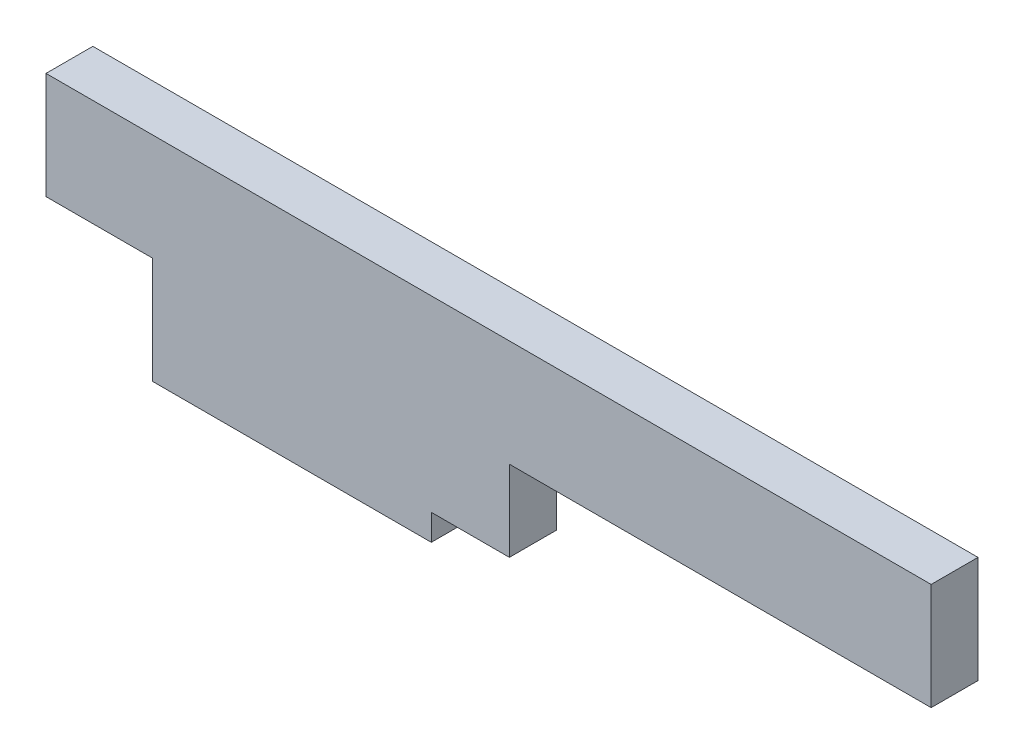
ISO-10303-21;
HEADER;
FILE_DESCRIPTION(('STEP AP214'),'2;1');
FILE_NAME('part.step','',(''),(''),'','','');
FILE_SCHEMA(('AUTOMOTIVE_DESIGN { 1 0 10303 214 1 1 1 1 }'));
ENDSEC;
DATA;
#1=APPLICATION_CONTEXT('core data for automotive mechanical design processes');
#2=APPLICATION_PROTOCOL_DEFINITION('international standard','automotive_design',2000,#1);
#3=PRODUCT_CONTEXT('',#1,'mechanical');
#4=PRODUCT('Part','Part','',(#3));
#5=PRODUCT_RELATED_PRODUCT_CATEGORY('part','',(#4));
#6=PRODUCT_DEFINITION_FORMATION('','',#4);
#7=PRODUCT_DEFINITION_CONTEXT('part definition',#1,'design');
#8=PRODUCT_DEFINITION('design','',#6,#7);
#9=PRODUCT_DEFINITION_SHAPE('','',#8);
#10=(LENGTH_UNIT() NAMED_UNIT(*) SI_UNIT(.MILLI.,.METRE.));
#11=(NAMED_UNIT(*) PLANE_ANGLE_UNIT() SI_UNIT($,.RADIAN.));
#12=(NAMED_UNIT(*) SI_UNIT($,.STERADIAN.) SOLID_ANGLE_UNIT());
#13=UNCERTAINTY_MEASURE_WITH_UNIT(LENGTH_MEASURE(1.E-05),#10,'distance_accuracy_value','');
#14=(GEOMETRIC_REPRESENTATION_CONTEXT(3) GLOBAL_UNCERTAINTY_ASSIGNED_CONTEXT((#13)) GLOBAL_UNIT_ASSIGNED_CONTEXT((#10,
#11,#12)) REPRESENTATION_CONTEXT('',''));
#15=CARTESIAN_POINT('',(0.,0.,0.));
#16=DIRECTION('',(0.,0.,1.));
#17=DIRECTION('',(1.,0.,0.));
#18=AXIS2_PLACEMENT_3D('',#15,#16,#17);
#19=CARTESIAN_POINT('',(-85.,-1.91479099678457,9.));
#20=DIRECTION('',(0.,1.,0.));
#21=DIRECTION('',(0.,0.,1.));
#22=AXIS2_PLACEMENT_3D('',#19,#20,#21);
#23=PLANE('',#22);
#24=DIRECTION('',(1.,0.,0.));
#25=VECTOR('',#24,1.);
#26=CARTESIAN_POINT('',(-85.,-1.91479099678457,0.));
#27=LINE('',#26,#25);
#28=CARTESIAN_POINT('',(-85.,-1.91479099678457,0.));
#29=VERTEX_POINT('',#28);
#30=CARTESIAN_POINT('',(-64.5,-1.91479099678457,0.));
#31=VERTEX_POINT('',#30);
#32=EDGE_CURVE('E152',#29,#31,#27,.T.);
#33=ORIENTED_EDGE('',*,*,#32,.T.);
#34=DIRECTION('',(0.,0.,-1.));
#35=VECTOR('',#34,1.);
#36=CARTESIAN_POINT('',(-64.5,-1.91479099678457,9.));
#37=LINE('',#36,#35);
#38=CARTESIAN_POINT('',(-64.5,-1.91479099678457,9.));
#39=VERTEX_POINT('',#38);
#40=EDGE_CURVE('E11',#39,#31,#37,.T.);
#41=ORIENTED_EDGE('',*,*,#40,.F.);
#42=DIRECTION('',(1.,0.,0.));
#43=VECTOR('',#42,1.);
#44=CARTESIAN_POINT('',(-85.,-1.91479099678457,9.));
#45=LINE('',#44,#43);
#46=CARTESIAN_POINT('',(-85.,-1.91479099678457,9.));
#47=VERTEX_POINT('',#46);
#48=EDGE_CURVE('E180',#47,#39,#45,.T.);
#49=ORIENTED_EDGE('',*,*,#48,.F.);
#50=DIRECTION('',(0.,0.,-1.));
#51=VECTOR('',#50,1.);
#52=CARTESIAN_POINT('',(-85.,-1.91479099678457,9.));
#53=LINE('',#52,#51);
#54=EDGE_CURVE('E148',#47,#29,#53,.T.);
#55=ORIENTED_EDGE('',*,*,#54,.T.);
#56=EDGE_LOOP('',(#33,#41,#49,#55));
#57=FACE_BOUND('',#56,.T.);
#58=ADVANCED_FACE('F39',(#57),#23,.F.);
#59=CARTESIAN_POINT('',(-64.5,-1.91479099678457,9.));
#60=DIRECTION('',(1.,0.,0.));
#61=DIRECTION('',(0.,0.,-1.));
#62=AXIS2_PLACEMENT_3D('',#59,#60,#61);
#63=PLANE('',#62);
#64=DIRECTION('',(0.,-1.,0.));
#65=VECTOR('',#64,1.);
#66=CARTESIAN_POINT('',(-64.5,-1.91479099678457,0.));
#67=LINE('',#66,#65);
#68=CARTESIAN_POINT('',(-64.5,-22.4147909967846,0.));
#69=VERTEX_POINT('',#68);
#70=EDGE_CURVE('E156',#31,#69,#67,.T.);
#71=ORIENTED_EDGE('',*,*,#70,.T.);
#72=DIRECTION('',(0.,0.,-1.));
#73=VECTOR('',#72,1.);
#74=CARTESIAN_POINT('',(-64.5,-22.4147909967846,9.));
#75=LINE('',#74,#73);
#76=CARTESIAN_POINT('',(-64.5,-22.4147909967846,9.));
#77=VERTEX_POINT('',#76);
#78=EDGE_CURVE('E48',#77,#69,#75,.T.);
#79=ORIENTED_EDGE('',*,*,#78,.F.);
#80=DIRECTION('',(0.,-1.,0.));
#81=VECTOR('',#80,1.);
#82=CARTESIAN_POINT('',(-64.5,-1.91479099678457,9.));
#83=LINE('',#82,#81);
#84=EDGE_CURVE('E105',#39,#77,#83,.T.);
#85=ORIENTED_EDGE('',*,*,#84,.F.);
#86=ORIENTED_EDGE('',*,*,#40,.T.);
#87=EDGE_LOOP('',(#71,#79,#85,#86));
#88=FACE_BOUND('',#87,.T.);
#89=ADVANCED_FACE('F244',(#88),#63,.F.);
#90=CARTESIAN_POINT('',(-64.5,-22.4147909967846,9.));
#91=DIRECTION('',(0.,1.,0.));
#92=DIRECTION('',(-1.,0.,0.));
#93=AXIS2_PLACEMENT_3D('',#90,#91,#92);
#94=PLANE('',#93);
#95=DIRECTION('',(1.,0.,0.));
#96=VECTOR('',#95,1.);
#97=CARTESIAN_POINT('',(-64.5,-22.4147909967846,0.));
#98=LINE('',#97,#96);
#99=CARTESIAN_POINT('',(-11.,-22.4147909967846,0.));
#100=VERTEX_POINT('',#99);
#101=EDGE_CURVE('E159',#69,#100,#98,.T.);
#102=ORIENTED_EDGE('',*,*,#101,.T.);
#103=DIRECTION('',(0.,0.,-1.));
#104=VECTOR('',#103,1.);
#105=CARTESIAN_POINT('',(-11.,-22.4147909967846,9.));
#106=LINE('',#105,#104);
#107=CARTESIAN_POINT('',(-11.,-22.4147909967846,9.));
#108=VERTEX_POINT('',#107);
#109=EDGE_CURVE('E199',#108,#100,#106,.T.);
#110=ORIENTED_EDGE('',*,*,#109,.F.);
#111=DIRECTION('',(1.,0.,0.));
#112=VECTOR('',#111,1.);
#113=CARTESIAN_POINT('',(-64.5,-22.4147909967846,9.));
#114=LINE('',#113,#112);
#115=EDGE_CURVE('E209',#77,#108,#114,.T.);
#116=ORIENTED_EDGE('',*,*,#115,.F.);
#117=ORIENTED_EDGE('',*,*,#78,.T.);
#118=EDGE_LOOP('',(#102,#110,#116,#117));
#119=FACE_BOUND('',#118,.T.);
#120=ADVANCED_FACE('F207',(#119),#94,.F.);
#121=CARTESIAN_POINT('',(-11.,-22.4147909967846,9.));
#122=DIRECTION('',(-1.,0.,0.));
#123=DIRECTION('',(0.,0.,1.));
#124=AXIS2_PLACEMENT_3D('',#121,#122,#123);
#125=PLANE('',#124);
#126=DIRECTION('',(0.,1.,0.));
#127=VECTOR('',#126,1.);
#128=CARTESIAN_POINT('',(-11.,-22.4147909967846,0.));
#129=LINE('',#128,#127);
#130=CARTESIAN_POINT('',(-11.,-17.4147909967846,0.));
#131=VERTEX_POINT('',#130);
#132=EDGE_CURVE('E162',#100,#131,#129,.T.);
#133=ORIENTED_EDGE('',*,*,#132,.T.);
#134=DIRECTION('',(0.,0.,-1.));
#135=VECTOR('',#134,1.);
#136=CARTESIAN_POINT('',(-11.,-17.4147909967846,9.));
#137=LINE('',#136,#135);
#138=CARTESIAN_POINT('',(-11.,-17.4147909967846,9.));
#139=VERTEX_POINT('',#138);
#140=EDGE_CURVE('E195',#139,#131,#137,.T.);
#141=ORIENTED_EDGE('',*,*,#140,.F.);
#142=DIRECTION('',(0.,1.,0.));
#143=VECTOR('',#142,1.);
#144=CARTESIAN_POINT('',(-11.,-22.4147909967846,9.));
#145=LINE('',#144,#143);
#146=EDGE_CURVE('E228',#108,#139,#145,.T.);
#147=ORIENTED_EDGE('',*,*,#146,.F.);
#148=ORIENTED_EDGE('',*,*,#109,.T.);
#149=EDGE_LOOP('',(#133,#141,#147,#148));
#150=FACE_BOUND('',#149,.T.);
#151=ADVANCED_FACE('F218',(#150),#125,.F.);
#152=CARTESIAN_POINT('',(-11.,-17.4147909967846,9.));
#153=DIRECTION('',(0.,1.,0.));
#154=DIRECTION('',(-1.,0.,0.));
#155=AXIS2_PLACEMENT_3D('',#152,#153,#154);
#156=PLANE('',#155);
#157=DIRECTION('',(1.,0.,0.));
#158=VECTOR('',#157,1.);
#159=CARTESIAN_POINT('',(-11.,-17.4147909967846,0.));
#160=LINE('',#159,#158);
#161=CARTESIAN_POINT('',(3.99999999999999,-17.4147909967846,0.));
#162=VERTEX_POINT('',#161);
#163=EDGE_CURVE('E165',#131,#162,#160,.T.);
#164=ORIENTED_EDGE('',*,*,#163,.T.);
#165=DIRECTION('',(0.,0.,-1.));
#166=VECTOR('',#165,1.);
#167=CARTESIAN_POINT('',(3.99999999999999,-17.4147909967846,9.));
#168=LINE('',#167,#166);
#169=CARTESIAN_POINT('',(3.99999999999999,-17.4147909967846,9.));
#170=VERTEX_POINT('',#169);
#171=EDGE_CURVE('E191',#170,#162,#168,.T.);
#172=ORIENTED_EDGE('',*,*,#171,.F.);
#173=DIRECTION('',(1.,0.,0.));
#174=VECTOR('',#173,1.);
#175=CARTESIAN_POINT('',(-11.,-17.4147909967846,9.));
#176=LINE('',#175,#174);
#177=EDGE_CURVE('E224',#139,#170,#176,.T.);
#178=ORIENTED_EDGE('',*,*,#177,.F.);
#179=ORIENTED_EDGE('',*,*,#140,.T.);
#180=EDGE_LOOP('',(#164,#172,#178,#179));
#181=FACE_BOUND('',#180,.T.);
#182=ADVANCED_FACE('F222',(#181),#156,.F.);
#183=CARTESIAN_POINT('',(3.99999999999999,-17.4147909967846,9.));
#184=DIRECTION('',(-1.,0.,0.));
#185=DIRECTION('',(0.,0.,1.));
#186=AXIS2_PLACEMENT_3D('',#183,#184,#185);
#187=PLANE('',#186);
#188=DIRECTION('',(0.,1.,0.));
#189=VECTOR('',#188,1.);
#190=CARTESIAN_POINT('',(3.99999999999999,-17.4147909967846,0.));
#191=LINE('',#190,#189);
#192=CARTESIAN_POINT('',(3.99999999999999,-1.91479099678458,0.));
#193=VERTEX_POINT('',#192);
#194=EDGE_CURVE('E168',#162,#193,#191,.T.);
#195=ORIENTED_EDGE('',*,*,#194,.T.);
#196=DIRECTION('',(0.,0.,-1.));
#197=VECTOR('',#196,1.);
#198=CARTESIAN_POINT('',(3.99999999999999,-1.91479099678458,9.));
#199=LINE('',#198,#197);
#200=CARTESIAN_POINT('',(3.99999999999999,-1.91479099678458,9.));
#201=VERTEX_POINT('',#200);
#202=EDGE_CURVE('E187',#201,#193,#199,.T.);
#203=ORIENTED_EDGE('',*,*,#202,.F.);
#204=DIRECTION('',(0.,1.,0.));
#205=VECTOR('',#204,1.);
#206=CARTESIAN_POINT('',(3.99999999999999,-17.4147909967846,9.));
#207=LINE('',#206,#205);
#208=EDGE_CURVE('E227',#170,#201,#207,.T.);
#209=ORIENTED_EDGE('',*,*,#208,.F.);
#210=ORIENTED_EDGE('',*,*,#171,.T.);
#211=EDGE_LOOP('',(#195,#203,#209,#210));
#212=FACE_BOUND('',#211,.T.);
#213=ADVANCED_FACE('F256',(#212),#187,.F.);
#214=CARTESIAN_POINT('',(85.,-1.91479099678457,9.));
#215=DIRECTION('',(0.,1.,0.));
#216=DIRECTION('',(-1.,0.,0.));
#217=AXIS2_PLACEMENT_3D('',#214,#215,#216);
#218=PLANE('',#217);
#219=DIRECTION('',(1.,0.,0.));
#220=VECTOR('',#219,1.);
#221=CARTESIAN_POINT('',(85.,-1.91479099678457,0.));
#222=LINE('',#221,#220);
#223=CARTESIAN_POINT('',(85.,-1.91479099678457,0.));
#224=VERTEX_POINT('',#223);
#225=EDGE_CURVE('E171',#193,#224,#222,.T.);
#226=ORIENTED_EDGE('',*,*,#225,.T.);
#227=DIRECTION('',(0.,0.,-1.));
#228=VECTOR('',#227,1.);
#229=CARTESIAN_POINT('',(85.,-1.91479099678457,9.));
#230=LINE('',#229,#228);
#231=CARTESIAN_POINT('',(85.,-1.91479099678457,9.));
#232=VERTEX_POINT('',#231);
#233=EDGE_CURVE('E141',#232,#224,#230,.T.);
#234=ORIENTED_EDGE('',*,*,#233,.F.);
#235=DIRECTION('',(1.,0.,0.));
#236=VECTOR('',#235,1.);
#237=CARTESIAN_POINT('',(85.,-1.91479099678457,9.));
#238=LINE('',#237,#236);
#239=EDGE_CURVE('E130',#201,#232,#238,.T.);
#240=ORIENTED_EDGE('',*,*,#239,.F.);
#241=ORIENTED_EDGE('',*,*,#202,.T.);
#242=EDGE_LOOP('',(#226,#234,#240,#241));
#243=FACE_BOUND('',#242,.T.);
#244=ADVANCED_FACE('F259',(#243),#218,.F.);
#245=CARTESIAN_POINT('',(85.,18.5852090032154,9.));
#246=DIRECTION('',(-1.,0.,0.));
#247=DIRECTION('',(0.,0.,1.));
#248=AXIS2_PLACEMENT_3D('',#245,#246,#247);
#249=PLANE('',#248);
#250=DIRECTION('',(0.,1.,0.));
#251=VECTOR('',#250,1.);
#252=CARTESIAN_POINT('',(85.,18.5852090032154,0.));
#253=LINE('',#252,#251);
#254=CARTESIAN_POINT('',(85.,18.5852090032154,0.));
#255=VERTEX_POINT('',#254);
#256=EDGE_CURVE('E139',#224,#255,#253,.T.);
#257=ORIENTED_EDGE('',*,*,#256,.T.);
#258=DIRECTION('',(0.,0.,-1.));
#259=VECTOR('',#258,1.);
#260=CARTESIAN_POINT('',(85.,18.5852090032154,9.));
#261=LINE('',#260,#259);
#262=CARTESIAN_POINT('',(85.,18.5852090032154,9.));
#263=VERTEX_POINT('',#262);
#264=EDGE_CURVE('E136',#263,#255,#261,.T.);
#265=ORIENTED_EDGE('',*,*,#264,.F.);
#266=DIRECTION('',(0.,1.,0.));
#267=VECTOR('',#266,1.);
#268=CARTESIAN_POINT('',(85.,18.5852090032154,9.));
#269=LINE('',#268,#267);
#270=EDGE_CURVE('E124',#232,#263,#269,.T.);
#271=ORIENTED_EDGE('',*,*,#270,.F.);
#272=ORIENTED_EDGE('',*,*,#233,.T.);
#273=EDGE_LOOP('',(#257,#265,#271,#272));
#274=FACE_BOUND('',#273,.T.);
#275=ADVANCED_FACE('F137',(#274),#249,.F.);
#276=CARTESIAN_POINT('',(-85.,18.5852090032154,9.));
#277=DIRECTION('',(0.,-1.,0.));
#278=DIRECTION('',(0.,0.,-1.));
#279=AXIS2_PLACEMENT_3D('',#276,#277,#278);
#280=PLANE('',#279);
#281=DIRECTION('',(-1.,0.,0.));
#282=VECTOR('',#281,1.);
#283=CARTESIAN_POINT('',(-85.,18.5852090032154,0.));
#284=LINE('',#283,#282);
#285=CARTESIAN_POINT('',(-85.,18.5852090032154,0.));
#286=VERTEX_POINT('',#285);
#287=EDGE_CURVE('E91',#255,#286,#284,.T.);
#288=ORIENTED_EDGE('',*,*,#287,.T.);
#289=DIRECTION('',(0.,0.,-1.));
#290=VECTOR('',#289,1.);
#291=CARTESIAN_POINT('',(-85.,18.5852090032154,9.));
#292=LINE('',#291,#290);
#293=CARTESIAN_POINT('',(-85.,18.5852090032154,9.));
#294=VERTEX_POINT('',#293);
#295=EDGE_CURVE('E142',#294,#286,#292,.T.);
#296=ORIENTED_EDGE('',*,*,#295,.F.);
#297=DIRECTION('',(-1.,0.,0.));
#298=VECTOR('',#297,1.);
#299=CARTESIAN_POINT('',(-85.,18.5852090032154,9.));
#300=LINE('',#299,#298);
#301=EDGE_CURVE('E128',#263,#294,#300,.T.);
#302=ORIENTED_EDGE('',*,*,#301,.F.);
#303=ORIENTED_EDGE('',*,*,#264,.T.);
#304=EDGE_LOOP('',(#288,#296,#302,#303));
#305=FACE_BOUND('',#304,.T.);
#306=ADVANCED_FACE('F144',(#305),#280,.F.);
#307=CARTESIAN_POINT('',(-85.,18.5852090032154,9.));
#308=DIRECTION('',(1.,0.,0.));
#309=DIRECTION('',(0.,0.,-1.));
#310=AXIS2_PLACEMENT_3D('',#307,#308,#309);
#311=PLANE('',#310);
#312=DIRECTION('',(0.,-1.,0.));
#313=VECTOR('',#312,1.);
#314=CARTESIAN_POINT('',(-85.,18.5852090032154,0.));
#315=LINE('',#314,#313);
#316=EDGE_CURVE('E97',#286,#29,#315,.T.);
#317=ORIENTED_EDGE('',*,*,#316,.T.);
#318=ORIENTED_EDGE('',*,*,#54,.F.);
#319=DIRECTION('',(0.,-1.,0.));
#320=VECTOR('',#319,1.);
#321=CARTESIAN_POINT('',(-85.,18.5852090032154,9.));
#322=LINE('',#321,#320);
#323=EDGE_CURVE('E56',#294,#47,#322,.T.);
#324=ORIENTED_EDGE('',*,*,#323,.F.);
#325=ORIENTED_EDGE('',*,*,#295,.T.);
#326=EDGE_LOOP('',(#317,#318,#324,#325));
#327=FACE_BOUND('',#326,.T.);
#328=ADVANCED_FACE('F268',(#327),#311,.F.);
#329=CARTESIAN_POINT('',(0.,0.,9.));
#330=DIRECTION('',(0.,0.,-1.));
#331=DIRECTION('',(-1.,0.,0.));
#332=AXIS2_PLACEMENT_3D('',#329,#330,#331);
#333=PLANE('',#332);
#334=ORIENTED_EDGE('',*,*,#48,.T.);
#335=ORIENTED_EDGE('',*,*,#84,.T.);
#336=ORIENTED_EDGE('',*,*,#115,.T.);
#337=ORIENTED_EDGE('',*,*,#146,.T.);
#338=ORIENTED_EDGE('',*,*,#177,.T.);
#339=ORIENTED_EDGE('',*,*,#208,.T.);
#340=ORIENTED_EDGE('',*,*,#239,.T.);
#341=ORIENTED_EDGE('',*,*,#270,.T.);
#342=ORIENTED_EDGE('',*,*,#301,.T.);
#343=ORIENTED_EDGE('',*,*,#323,.T.);
#344=EDGE_LOOP('',(#334,#335,#336,#337,#338,#339,#340,#341,#342,#343));
#345=FACE_BOUND('',#344,.T.);
#346=ADVANCED_FACE('F126',(#345),#333,.F.);
#347=CARTESIAN_POINT('',(0.,0.,0.));
#348=DIRECTION('',(0.,0.,-1.));
#349=DIRECTION('',(-1.,0.,0.));
#350=AXIS2_PLACEMENT_3D('',#347,#348,#349);
#351=PLANE('',#350);
#352=ORIENTED_EDGE('',*,*,#32,.F.);
#353=ORIENTED_EDGE('',*,*,#316,.F.);
#354=ORIENTED_EDGE('',*,*,#287,.F.);
#355=ORIENTED_EDGE('',*,*,#256,.F.);
#356=ORIENTED_EDGE('',*,*,#225,.F.);
#357=ORIENTED_EDGE('',*,*,#194,.F.);
#358=ORIENTED_EDGE('',*,*,#163,.F.);
#359=ORIENTED_EDGE('',*,*,#132,.F.);
#360=ORIENTED_EDGE('',*,*,#101,.F.);
#361=ORIENTED_EDGE('',*,*,#70,.F.);
#362=EDGE_LOOP('',(#352,#353,#354,#355,#356,#357,#358,#359,#360,#361));
#363=FACE_BOUND('',#362,.T.);
#364=ADVANCED_FACE('F213',(#363),#351,.T.);
#365=CLOSED_SHELL('',(#58,#89,#120,#151,#182,#213,#244,#275,#306,#328,#346,#364));
#366=MANIFOLD_SOLID_BREP('B2',#365);
#367=ADVANCED_BREP_SHAPE_REPRESENTATION('',(#18,#366),#14);
#368=SHAPE_DEFINITION_REPRESENTATION(#9,#367);
ENDSEC;
END-ISO-10303-21;
